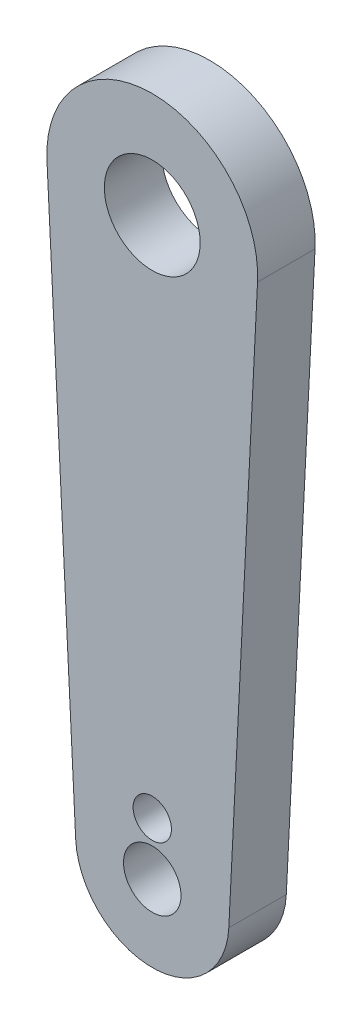
ISO-10303-21;
HEADER;
FILE_DESCRIPTION(('STEP AP214'),'2;1');
FILE_NAME('part.step','',(''),(''),'','','');
FILE_SCHEMA(('AUTOMOTIVE_DESIGN { 1 0 10303 214 1 1 1 1 }'));
ENDSEC;
DATA;
#1=APPLICATION_CONTEXT('core data for automotive mechanical design processes');
#2=APPLICATION_PROTOCOL_DEFINITION('international standard','automotive_design',2000,#1);
#3=PRODUCT_CONTEXT('',#1,'mechanical');
#4=PRODUCT('Part','Part','',(#3));
#5=PRODUCT_RELATED_PRODUCT_CATEGORY('part','',(#4));
#6=PRODUCT_DEFINITION_FORMATION('','',#4);
#7=PRODUCT_DEFINITION_CONTEXT('part definition',#1,'design');
#8=PRODUCT_DEFINITION('design','',#6,#7);
#9=PRODUCT_DEFINITION_SHAPE('','',#8);
#10=(LENGTH_UNIT() NAMED_UNIT(*) SI_UNIT(.MILLI.,.METRE.));
#11=(NAMED_UNIT(*) PLANE_ANGLE_UNIT() SI_UNIT($,.RADIAN.));
#12=(NAMED_UNIT(*) SI_UNIT($,.STERADIAN.) SOLID_ANGLE_UNIT());
#13=UNCERTAINTY_MEASURE_WITH_UNIT(LENGTH_MEASURE(1.E-05),#10,'distance_accuracy_value','');
#14=(GEOMETRIC_REPRESENTATION_CONTEXT(3) GLOBAL_UNCERTAINTY_ASSIGNED_CONTEXT((#13)) GLOBAL_UNIT_ASSIGNED_CONTEXT((#10,
#11,#12)) REPRESENTATION_CONTEXT('',''));
#15=CARTESIAN_POINT('',(0.,0.,0.));
#16=DIRECTION('',(0.,0.,1.));
#17=DIRECTION('',(1.,0.,0.));
#18=AXIS2_PLACEMENT_3D('',#15,#16,#17);
#19=CARTESIAN_POINT('',(-16.0018732621248,36.3702933448505,106.90730041568));
#20=DIRECTION('',(0.,0.,1.));
#21=DIRECTION('',(1.,0.,0.));
#22=AXIS2_PLACEMENT_3D('',#19,#20,#21);
#23=PLANE('',#22);
#24=CARTESIAN_POINT('',(-16.0018732621248,36.3702933448505,106.90730041568));
#25=DIRECTION('',(0.,0.,1.));
#26=DIRECTION('',(1.,0.,0.));
#27=AXIS2_PLACEMENT_3D('',#24,#25,#26);
#28=CIRCLE('',#27,2.5);
#29=CARTESIAN_POINT('',(-13.5018732621248,36.3702933448505,106.90730041568));
#30=VERTEX_POINT('',#29);
#31=EDGE_CURVE('E119',#30,#30,#28,.T.);
#32=ORIENTED_EDGE('',*,*,#31,.F.);
#33=EDGE_LOOP('',(#32));
#34=FACE_BOUND('',#33,.T.);
#35=CARTESIAN_POINT('',(-16.0018732621248,36.3702933448505,106.90730041568));
#36=DIRECTION('',(0.,0.,1.));
#37=DIRECTION('',(1.,0.,0.));
#38=AXIS2_PLACEMENT_3D('',#35,#36,#37);
#39=CIRCLE('',#38,5.5);
#40=CARTESIAN_POINT('',(-10.5087525643794,36.0952933448505,106.90730041568));
#41=VERTEX_POINT('',#40);
#42=CARTESIAN_POINT('',(-21.4949939598703,36.0952933448505,106.90730041568));
#43=VERTEX_POINT('',#42);
#44=EDGE_CURVE('E89',#41,#43,#39,.T.);
#45=ORIENTED_EDGE('',*,*,#44,.T.);
#46=DIRECTION('',(0.0499999999999996,-0.998749217771909,0.));
#47=VECTOR('',#46,1.);
#48=CARTESIAN_POINT('',(-21.4949939598703,36.0952933448505,106.90730041568));
#49=LINE('',#48,#47);
#50=CARTESIAN_POINT('',(-19.9968701332125,6.17029334485052,106.90730041568));
#51=VERTEX_POINT('',#50);
#52=EDGE_CURVE('E84',#43,#51,#49,.T.);
#53=ORIENTED_EDGE('',*,*,#52,.T.);
#54=CARTESIAN_POINT('',(-16.0018732621248,6.37029334485052,106.90730041568));
#55=DIRECTION('',(0.,0.,1.));
#56=DIRECTION('',(1.,0.,0.));
#57=AXIS2_PLACEMENT_3D('',#54,#55,#56);
#58=CIRCLE('',#57,4.00000000000001);
#59=CARTESIAN_POINT('',(-12.0068763910372,6.17029334485052,106.90730041568));
#60=VERTEX_POINT('',#59);
#61=EDGE_CURVE('E87',#51,#60,#58,.T.);
#62=ORIENTED_EDGE('',*,*,#61,.T.);
#63=DIRECTION('',(0.0499999999999996,0.998749217771909,0.));
#64=VECTOR('',#63,1.);
#65=CARTESIAN_POINT('',(-10.5087525643794,36.0952933448505,106.90730041568));
#66=LINE('',#65,#64);
#67=EDGE_CURVE('E54',#60,#41,#66,.T.);
#68=ORIENTED_EDGE('',*,*,#67,.T.);
#69=EDGE_LOOP('',(#45,#53,#62,#68));
#70=FACE_BOUND('',#69,.T.);
#71=CARTESIAN_POINT('',(-16.0018732621248,6.37029334485052,106.90730041568));
#72=DIRECTION('',(0.,0.,1.));
#73=DIRECTION('',(1.,0.,0.));
#74=AXIS2_PLACEMENT_3D('',#71,#72,#73);
#75=CIRCLE('',#74,1.49999999999999);
#76=CARTESIAN_POINT('',(-14.5018732621249,6.37029334485052,106.90730041568));
#77=VERTEX_POINT('',#76);
#78=EDGE_CURVE('E104',#77,#77,#75,.T.);
#79=ORIENTED_EDGE('',*,*,#78,.F.);
#80=EDGE_LOOP('',(#79));
#81=FACE_BOUND('',#80,.T.);
#82=CARTESIAN_POINT('',(-16.0018732621248,9.12029334485052,106.90730041568));
#83=DIRECTION('',(0.,0.,1.));
#84=DIRECTION('',(1.,0.,0.));
#85=AXIS2_PLACEMENT_3D('',#82,#83,#84);
#86=CIRCLE('',#85,1.);
#87=CARTESIAN_POINT('',(-15.0018732621248,9.12029334485052,106.90730041568));
#88=VERTEX_POINT('',#87);
#89=EDGE_CURVE('E125',#88,#88,#86,.T.);
#90=ORIENTED_EDGE('',*,*,#89,.F.);
#91=EDGE_LOOP('',(#90));
#92=FACE_BOUND('',#91,.T.);
#93=ADVANCED_FACE('F37',(#34,#70,#81,#92),#23,.T.);
#94=CARTESIAN_POINT('',(-16.0018732621248,36.3702933448505,103.90730041568));
#95=DIRECTION('',(0.,0.,1.));
#96=DIRECTION('',(1.,0.,0.));
#97=AXIS2_PLACEMENT_3D('',#94,#95,#96);
#98=PLANE('',#97);
#99=CARTESIAN_POINT('',(-16.0018732621248,36.3702933448505,103.90730041568));
#100=DIRECTION('',(0.,0.,1.));
#101=DIRECTION('',(1.,0.,0.));
#102=AXIS2_PLACEMENT_3D('',#99,#100,#101);
#103=CIRCLE('',#102,5.5);
#104=CARTESIAN_POINT('',(-10.5087525643794,36.0952933448505,103.90730041568));
#105=VERTEX_POINT('',#104);
#106=CARTESIAN_POINT('',(-21.4949939598703,36.0952933448505,103.90730041568));
#107=VERTEX_POINT('',#106);
#108=EDGE_CURVE('E101',#105,#107,#103,.T.);
#109=ORIENTED_EDGE('',*,*,#108,.F.);
#110=DIRECTION('',(0.0499999999999996,0.998749217771909,0.));
#111=VECTOR('',#110,1.);
#112=CARTESIAN_POINT('',(-10.5087525643794,36.0952933448505,103.90730041568));
#113=LINE('',#112,#111);
#114=CARTESIAN_POINT('',(-12.0068763910372,6.17029334485052,103.90730041568));
#115=VERTEX_POINT('',#114);
#116=EDGE_CURVE('E77',#115,#105,#113,.T.);
#117=ORIENTED_EDGE('',*,*,#116,.F.);
#118=CARTESIAN_POINT('',(-16.0018732621248,6.37029334485052,103.90730041568));
#119=DIRECTION('',(0.,0.,1.));
#120=DIRECTION('',(1.,0.,0.));
#121=AXIS2_PLACEMENT_3D('',#118,#119,#120);
#122=CIRCLE('',#121,4.00000000000001);
#123=CARTESIAN_POINT('',(-19.9968701332125,6.17029334485052,103.90730041568));
#124=VERTEX_POINT('',#123);
#125=EDGE_CURVE('E71',#124,#115,#122,.T.);
#126=ORIENTED_EDGE('',*,*,#125,.F.);
#127=DIRECTION('',(0.0499999999999996,-0.998749217771909,0.));
#128=VECTOR('',#127,1.);
#129=CARTESIAN_POINT('',(-21.4949939598703,36.0952933448505,103.90730041568));
#130=LINE('',#129,#128);
#131=EDGE_CURVE('E93',#107,#124,#130,.T.);
#132=ORIENTED_EDGE('',*,*,#131,.F.);
#133=EDGE_LOOP('',(#109,#117,#126,#132));
#134=FACE_BOUND('',#133,.T.);
#135=CARTESIAN_POINT('',(-16.0018732621248,6.37029334485052,103.90730041568));
#136=DIRECTION('',(0.,0.,1.));
#137=DIRECTION('',(1.,0.,0.));
#138=AXIS2_PLACEMENT_3D('',#135,#136,#137);
#139=CIRCLE('',#138,1.49999999999999);
#140=CARTESIAN_POINT('',(-14.5018732621249,6.37029334485052,103.90730041568));
#141=VERTEX_POINT('',#140);
#142=EDGE_CURVE('E116',#141,#141,#139,.T.);
#143=ORIENTED_EDGE('',*,*,#142,.T.);
#144=EDGE_LOOP('',(#143));
#145=FACE_BOUND('',#144,.T.);
#146=CARTESIAN_POINT('',(-16.0018732621248,36.3702933448505,103.90730041568));
#147=DIRECTION('',(0.,0.,1.));
#148=DIRECTION('',(1.,0.,0.));
#149=AXIS2_PLACEMENT_3D('',#146,#147,#148);
#150=CIRCLE('',#149,2.5);
#151=CARTESIAN_POINT('',(-13.5018732621248,36.3702933448505,103.90730041568));
#152=VERTEX_POINT('',#151);
#153=EDGE_CURVE('E122',#152,#152,#150,.T.);
#154=ORIENTED_EDGE('',*,*,#153,.T.);
#155=EDGE_LOOP('',(#154));
#156=FACE_BOUND('',#155,.T.);
#157=CARTESIAN_POINT('',(-16.0018732621248,9.12029334485052,103.90730041568));
#158=DIRECTION('',(0.,0.,1.));
#159=DIRECTION('',(1.,0.,0.));
#160=AXIS2_PLACEMENT_3D('',#157,#158,#159);
#161=CIRCLE('',#160,1.);
#162=CARTESIAN_POINT('',(-15.0018732621248,9.12029334485052,103.90730041568));
#163=VERTEX_POINT('',#162);
#164=EDGE_CURVE('E128',#163,#163,#161,.T.);
#165=ORIENTED_EDGE('',*,*,#164,.T.);
#166=EDGE_LOOP('',(#165));
#167=FACE_BOUND('',#166,.T.);
#168=ADVANCED_FACE('F112',(#134,#145,#156,#167),#98,.F.);
#169=CARTESIAN_POINT('',(-16.0018732621248,36.3702933448505,106.90730041568));
#170=DIRECTION('',(0.,0.,-1.));
#171=DIRECTION('',(-1.,0.,0.));
#172=AXIS2_PLACEMENT_3D('',#169,#170,#171);
#173=CYLINDRICAL_SURFACE('',#172,5.5);
#174=ORIENTED_EDGE('',*,*,#108,.T.);
#175=DIRECTION('',(0.,0.,-1.));
#176=VECTOR('',#175,1.);
#177=CARTESIAN_POINT('',(-21.4949939598703,36.0952933448505,106.90730041568));
#178=LINE('',#177,#176);
#179=EDGE_CURVE('E11',#43,#107,#178,.T.);
#180=ORIENTED_EDGE('',*,*,#179,.F.);
#181=ORIENTED_EDGE('',*,*,#44,.F.);
#182=DIRECTION('',(0.,0.,-1.));
#183=VECTOR('',#182,1.);
#184=CARTESIAN_POINT('',(-10.5087525643794,36.0952933448505,106.90730041568));
#185=LINE('',#184,#183);
#186=EDGE_CURVE('E97',#41,#105,#185,.T.);
#187=ORIENTED_EDGE('',*,*,#186,.T.);
#188=EDGE_LOOP('',(#174,#180,#181,#187));
#189=FACE_BOUND('',#188,.T.);
#190=ADVANCED_FACE('F39',(#189),#173,.T.);
#191=CARTESIAN_POINT('',(-21.4949939598703,36.0952933448505,106.90730041568));
#192=DIRECTION('',(0.998749217771909,0.0499999999999996,0.));
#193=DIRECTION('',(-0.0499999999999996,0.998749217771909,0.));
#194=AXIS2_PLACEMENT_3D('',#191,#192,#193);
#195=PLANE('',#194);
#196=ORIENTED_EDGE('',*,*,#131,.T.);
#197=DIRECTION('',(0.,0.,-1.));
#198=VECTOR('',#197,1.);
#199=CARTESIAN_POINT('',(-19.9968701332125,6.17029334485052,106.90730041568));
#200=LINE('',#199,#198);
#201=EDGE_CURVE('E46',#51,#124,#200,.T.);
#202=ORIENTED_EDGE('',*,*,#201,.F.);
#203=ORIENTED_EDGE('',*,*,#52,.F.);
#204=ORIENTED_EDGE('',*,*,#179,.T.);
#205=EDGE_LOOP('',(#196,#202,#203,#204));
#206=FACE_BOUND('',#205,.T.);
#207=ADVANCED_FACE('F92',(#206),#195,.F.);
#208=CARTESIAN_POINT('',(-16.0018732621248,6.37029334485052,106.90730041568));
#209=DIRECTION('',(0.,0.,-1.));
#210=DIRECTION('',(-1.,0.,0.));
#211=AXIS2_PLACEMENT_3D('',#208,#209,#210);
#212=CYLINDRICAL_SURFACE('',#211,4.00000000000001);
#213=ORIENTED_EDGE('',*,*,#125,.T.);
#214=DIRECTION('',(0.,0.,-1.));
#215=VECTOR('',#214,1.);
#216=CARTESIAN_POINT('',(-12.0068763910372,6.17029334485052,106.90730041568));
#217=LINE('',#216,#215);
#218=EDGE_CURVE('E94',#60,#115,#217,.T.);
#219=ORIENTED_EDGE('',*,*,#218,.F.);
#220=ORIENTED_EDGE('',*,*,#61,.F.);
#221=ORIENTED_EDGE('',*,*,#201,.T.);
#222=EDGE_LOOP('',(#213,#219,#220,#221));
#223=FACE_BOUND('',#222,.T.);
#224=ADVANCED_FACE('F95',(#223),#212,.T.);
#225=CARTESIAN_POINT('',(-10.5087525643794,36.0952933448505,106.90730041568));
#226=DIRECTION('',(-0.998749217771909,0.0499999999999996,0.));
#227=DIRECTION('',(-0.0499999999999996,-0.998749217771909,0.));
#228=AXIS2_PLACEMENT_3D('',#225,#226,#227);
#229=PLANE('',#228);
#230=ORIENTED_EDGE('',*,*,#116,.T.);
#231=ORIENTED_EDGE('',*,*,#186,.F.);
#232=ORIENTED_EDGE('',*,*,#67,.F.);
#233=ORIENTED_EDGE('',*,*,#218,.T.);
#234=EDGE_LOOP('',(#230,#231,#232,#233));
#235=FACE_BOUND('',#234,.T.);
#236=ADVANCED_FACE('F109',(#235),#229,.F.);
#237=CARTESIAN_POINT('',(-16.0018732621248,6.37029334485052,106.90730041568));
#238=DIRECTION('',(0.,0.,-1.));
#239=DIRECTION('',(-1.,0.,0.));
#240=AXIS2_PLACEMENT_3D('',#237,#238,#239);
#241=CYLINDRICAL_SURFACE('',#240,1.49999999999999);
#242=ORIENTED_EDGE('',*,*,#78,.T.);
#243=EDGE_LOOP('',(#242));
#244=FACE_BOUND('',#243,.T.);
#245=ORIENTED_EDGE('',*,*,#142,.F.);
#246=EDGE_LOOP('',(#245));
#247=FACE_BOUND('',#246,.T.);
#248=ADVANCED_FACE('F146',(#244,#247),#241,.F.);
#249=CARTESIAN_POINT('',(-16.0018732621248,36.3702933448505,106.90730041568));
#250=DIRECTION('',(0.,0.,-1.));
#251=DIRECTION('',(-1.,0.,0.));
#252=AXIS2_PLACEMENT_3D('',#249,#250,#251);
#253=CYLINDRICAL_SURFACE('',#252,2.5);
#254=ORIENTED_EDGE('',*,*,#31,.T.);
#255=EDGE_LOOP('',(#254));
#256=FACE_BOUND('',#255,.T.);
#257=ORIENTED_EDGE('',*,*,#153,.F.);
#258=EDGE_LOOP('',(#257));
#259=FACE_BOUND('',#258,.T.);
#260=ADVANCED_FACE('F192',(#256,#259),#253,.F.);
#261=CARTESIAN_POINT('',(-16.0018732621248,9.12029334485052,106.90730041568));
#262=DIRECTION('',(0.,0.,-1.));
#263=DIRECTION('',(-1.,0.,0.));
#264=AXIS2_PLACEMENT_3D('',#261,#262,#263);
#265=CYLINDRICAL_SURFACE('',#264,1.);
#266=ORIENTED_EDGE('',*,*,#89,.T.);
#267=EDGE_LOOP('',(#266));
#268=FACE_BOUND('',#267,.T.);
#269=ORIENTED_EDGE('',*,*,#164,.F.);
#270=EDGE_LOOP('',(#269));
#271=FACE_BOUND('',#270,.T.);
#272=ADVANCED_FACE('F134',(#268,#271),#265,.F.);
#273=CLOSED_SHELL('',(#93,#168,#190,#207,#224,#236,#248,#260,#272));
#274=MANIFOLD_SOLID_BREP('B2',#273);
#275=ADVANCED_BREP_SHAPE_REPRESENTATION('',(#18,#274),#14);
#276=SHAPE_DEFINITION_REPRESENTATION(#9,#275);
ENDSEC;
END-ISO-10303-21;
